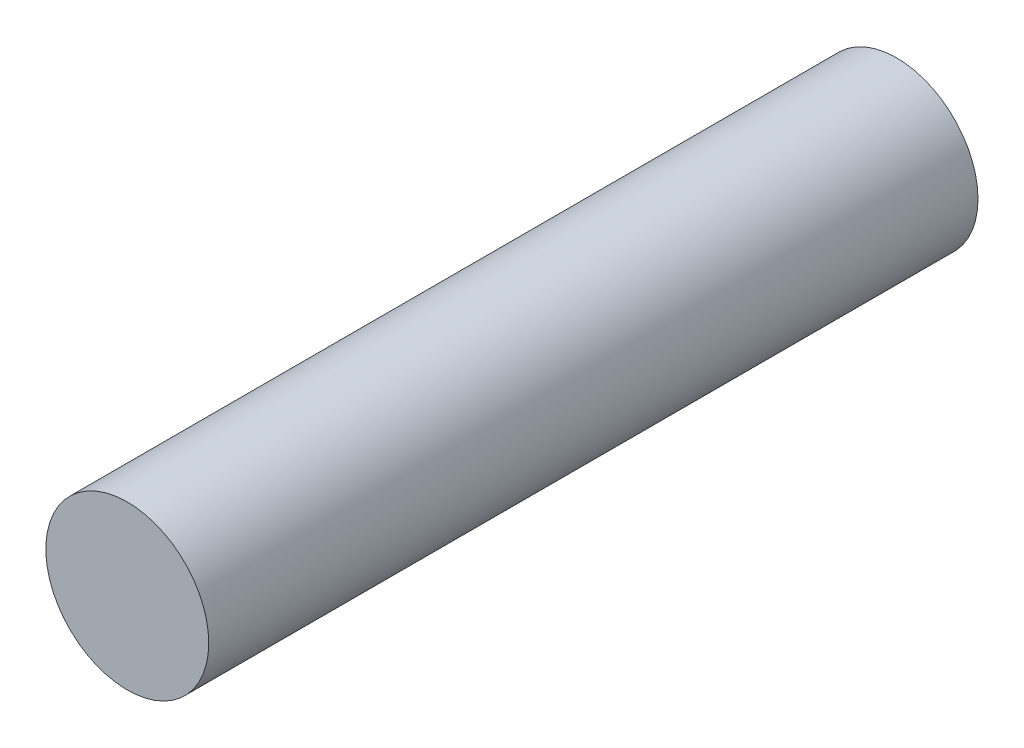
ISO-10303-21;
HEADER;
FILE_DESCRIPTION(('STEP AP214'),'2;1');
FILE_NAME('part.step','',(''),(''),'','','');
FILE_SCHEMA(('AUTOMOTIVE_DESIGN { 1 0 10303 214 1 1 1 1 }'));
ENDSEC;
DATA;
#1=APPLICATION_CONTEXT('core data for automotive mechanical design processes');
#2=APPLICATION_PROTOCOL_DEFINITION('international standard','automotive_design',2000,#1);
#3=PRODUCT_CONTEXT('',#1,'mechanical');
#4=PRODUCT('Part','Part','',(#3));
#5=PRODUCT_RELATED_PRODUCT_CATEGORY('part','',(#4));
#6=PRODUCT_DEFINITION_FORMATION('','',#4);
#7=PRODUCT_DEFINITION_CONTEXT('part definition',#1,'design');
#8=PRODUCT_DEFINITION('design','',#6,#7);
#9=PRODUCT_DEFINITION_SHAPE('','',#8);
#10=(LENGTH_UNIT() NAMED_UNIT(*) SI_UNIT(.MILLI.,.METRE.));
#11=(NAMED_UNIT(*) PLANE_ANGLE_UNIT() SI_UNIT($,.RADIAN.));
#12=(NAMED_UNIT(*) SI_UNIT($,.STERADIAN.) SOLID_ANGLE_UNIT());
#13=UNCERTAINTY_MEASURE_WITH_UNIT(LENGTH_MEASURE(1.E-05),#10,'distance_accuracy_value','');
#14=(GEOMETRIC_REPRESENTATION_CONTEXT(3) GLOBAL_UNCERTAINTY_ASSIGNED_CONTEXT((#13)) GLOBAL_UNIT_ASSIGNED_CONTEXT((#10,
#11,#12)) REPRESENTATION_CONTEXT('',''));
#15=CARTESIAN_POINT('',(0.,0.,0.));
#16=DIRECTION('',(0.,0.,1.));
#17=DIRECTION('',(1.,0.,0.));
#18=AXIS2_PLACEMENT_3D('',#15,#16,#17);
#19=CARTESIAN_POINT('',(0.,0.,85.));
#20=DIRECTION('',(0.,0.,-1.));
#21=DIRECTION('',(-1.,0.,0.));
#22=AXIS2_PLACEMENT_3D('',#19,#20,#21);
#23=CYLINDRICAL_SURFACE('',#22,9.);
#24=CARTESIAN_POINT('',(0.,0.,85.));
#25=DIRECTION('',(0.,0.,1.));
#26=DIRECTION('',(1.,0.,0.));
#27=AXIS2_PLACEMENT_3D('',#24,#25,#26);
#28=CIRCLE('',#27,9.);
#29=CARTESIAN_POINT('',(9.,0.,85.));
#30=VERTEX_POINT('',#29);
#31=EDGE_CURVE('E10',#30,#30,#28,.T.);
#32=ORIENTED_EDGE('',*,*,#31,.F.);
#33=EDGE_LOOP('',(#32));
#34=FACE_BOUND('',#33,.T.);
#35=CARTESIAN_POINT('',(0.,0.,0.));
#36=DIRECTION('',(0.,0.,1.));
#37=DIRECTION('',(1.,0.,0.));
#38=AXIS2_PLACEMENT_3D('',#35,#36,#37);
#39=CIRCLE('',#38,9.);
#40=CARTESIAN_POINT('',(9.,0.,0.));
#41=VERTEX_POINT('',#40);
#42=EDGE_CURVE('E36',#41,#41,#39,.T.);
#43=ORIENTED_EDGE('',*,*,#42,.T.);
#44=EDGE_LOOP('',(#43));
#45=FACE_BOUND('',#44,.T.);
#46=ADVANCED_FACE('F33',(#34,#45),#23,.T.);
#47=CARTESIAN_POINT('',(0.,0.,85.));
#48=DIRECTION('',(0.,0.,1.));
#49=DIRECTION('',(1.,0.,0.));
#50=AXIS2_PLACEMENT_3D('',#47,#48,#49);
#51=PLANE('',#50);
#52=ORIENTED_EDGE('',*,*,#31,.T.);
#53=EDGE_LOOP('',(#52));
#54=FACE_BOUND('',#53,.T.);
#55=ADVANCED_FACE('F48',(#54),#51,.T.);
#56=CARTESIAN_POINT('',(0.,0.,0.));
#57=DIRECTION('',(0.,0.,1.));
#58=DIRECTION('',(1.,0.,0.));
#59=AXIS2_PLACEMENT_3D('',#56,#57,#58);
#60=PLANE('',#59);
#61=ORIENTED_EDGE('',*,*,#42,.F.);
#62=EDGE_LOOP('',(#61));
#63=FACE_BOUND('',#62,.T.);
#64=ADVANCED_FACE('F46',(#63),#60,.F.);
#65=CLOSED_SHELL('',(#46,#55,#64));
#66=MANIFOLD_SOLID_BREP('B2',#65);
#67=ADVANCED_BREP_SHAPE_REPRESENTATION('',(#18,#66),#14);
#68=SHAPE_DEFINITION_REPRESENTATION(#9,#67);
ENDSEC;
END-ISO-10303-21;
